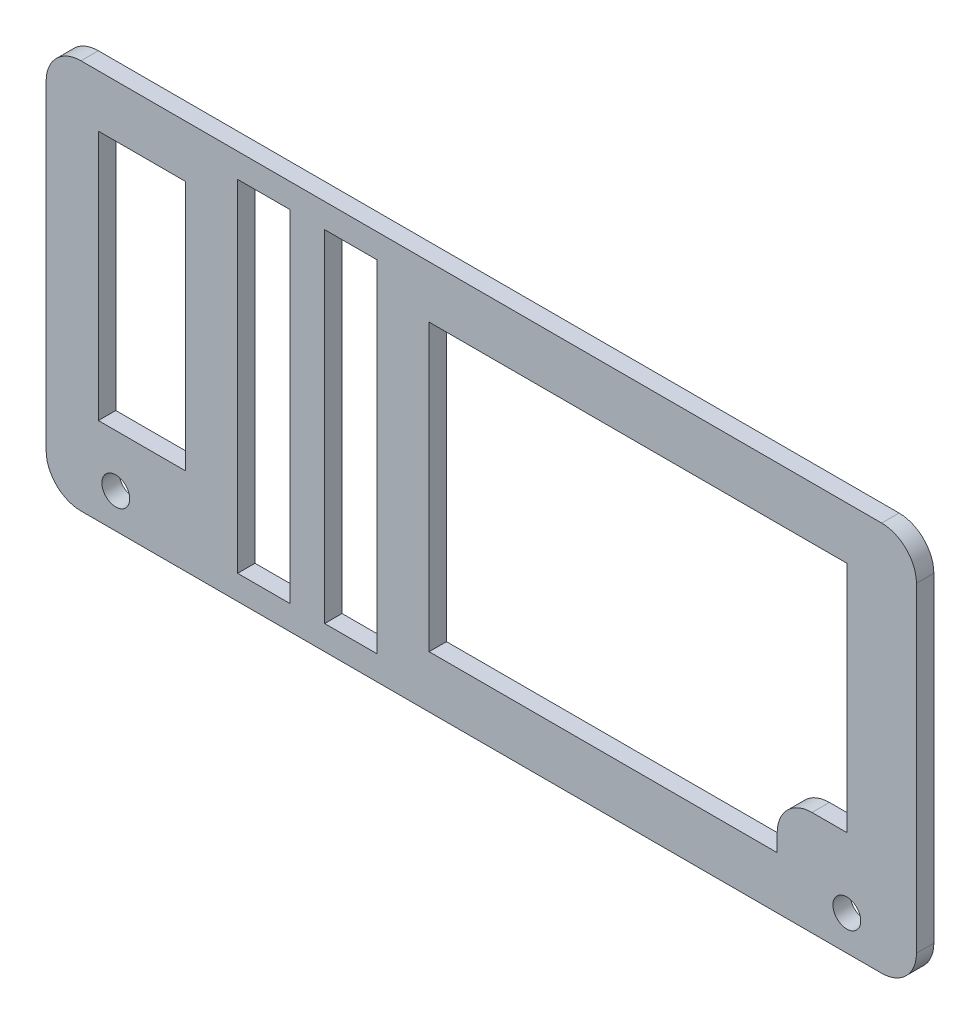
ISO-10303-21;
HEADER;
FILE_DESCRIPTION(('STEP AP214'),'2;1');
FILE_NAME('part.step','',(''),(''),'','','');
FILE_SCHEMA(('AUTOMOTIVE_DESIGN { 1 0 10303 214 1 1 1 1 }'));
ENDSEC;
DATA;
#1=APPLICATION_CONTEXT('core data for automotive mechanical design processes');
#2=APPLICATION_PROTOCOL_DEFINITION('international standard','automotive_design',2000,#1);
#3=PRODUCT_CONTEXT('',#1,'mechanical');
#4=PRODUCT('Part','Part','',(#3));
#5=PRODUCT_RELATED_PRODUCT_CATEGORY('part','',(#4));
#6=PRODUCT_DEFINITION_FORMATION('','',#4);
#7=PRODUCT_DEFINITION_CONTEXT('part definition',#1,'design');
#8=PRODUCT_DEFINITION('design','',#6,#7);
#9=PRODUCT_DEFINITION_SHAPE('','',#8);
#10=(LENGTH_UNIT() NAMED_UNIT(*) SI_UNIT(.MILLI.,.METRE.));
#11=(NAMED_UNIT(*) PLANE_ANGLE_UNIT() SI_UNIT($,.RADIAN.));
#12=(NAMED_UNIT(*) SI_UNIT($,.STERADIAN.) SOLID_ANGLE_UNIT());
#13=UNCERTAINTY_MEASURE_WITH_UNIT(LENGTH_MEASURE(1.E-05),#10,'distance_accuracy_value','');
#14=(GEOMETRIC_REPRESENTATION_CONTEXT(3) GLOBAL_UNCERTAINTY_ASSIGNED_CONTEXT((#13)) GLOBAL_UNIT_ASSIGNED_CONTEXT((#10,
#11,#12)) REPRESENTATION_CONTEXT('',''));
#15=CARTESIAN_POINT('',(0.,0.,0.));
#16=DIRECTION('',(0.,0.,1.));
#17=DIRECTION('',(1.,0.,0.));
#18=AXIS2_PLACEMENT_3D('',#15,#16,#17);
#19=CARTESIAN_POINT('',(-182.664233576642,87.9124087591241,5.));
#20=DIRECTION('',(1.,0.,0.));
#21=DIRECTION('',(0.,0.,-1.));
#22=AXIS2_PLACEMENT_3D('',#19,#20,#21);
#23=PLANE('',#22);
#24=DIRECTION('',(0.,-1.,0.));
#25=VECTOR('',#24,1.);
#26=CARTESIAN_POINT('',(-182.664233576642,87.9124087591241,0.));
#27=LINE('',#26,#25);
#28=CARTESIAN_POINT('',(-182.664233576642,77.9124087591241,0.));
#29=VERTEX_POINT('',#28);
#30=CARTESIAN_POINT('',(-182.664233576642,-14.0875912408759,0.));
#31=VERTEX_POINT('',#30);
#32=EDGE_CURVE('E339',#29,#31,#27,.T.);
#33=ORIENTED_EDGE('',*,*,#32,.T.);
#34=DIRECTION('',(0.,0.,-1.));
#35=VECTOR('',#34,1.);
#36=CARTESIAN_POINT('',(-182.664233576642,-14.0875912408759,5.));
#37=LINE('',#36,#35);
#38=CARTESIAN_POINT('',(-182.664233576642,-14.0875912408759,5.));
#39=VERTEX_POINT('',#38);
#40=EDGE_CURVE('E412',#31,#39,#37,.F.);
#41=ORIENTED_EDGE('',*,*,#40,.T.);
#42=DIRECTION('',(0.,-1.,0.));
#43=VECTOR('',#42,1.);
#44=CARTESIAN_POINT('',(-182.664233576642,87.9124087591241,5.));
#45=LINE('',#44,#43);
#46=CARTESIAN_POINT('',(-182.664233576642,77.9124087591241,5.));
#47=VERTEX_POINT('',#46);
#48=EDGE_CURVE('E325',#47,#39,#45,.T.);
#49=ORIENTED_EDGE('',*,*,#48,.F.);
#50=DIRECTION('',(0.,0.,-1.));
#51=VECTOR('',#50,1.);
#52=CARTESIAN_POINT('',(-182.664233576642,77.9124087591241,0.));
#53=LINE('',#52,#51);
#54=EDGE_CURVE('E409',#47,#29,#53,.T.);
#55=ORIENTED_EDGE('',*,*,#54,.T.);
#56=EDGE_LOOP('',(#33,#41,#49,#55));
#57=FACE_BOUND('',#56,.T.);
#58=ADVANCED_FACE('F34',(#57),#23,.F.);
#59=CARTESIAN_POINT('',(-182.664233576642,-24.0875912408759,5.));
#60=DIRECTION('',(0.,1.,0.));
#61=DIRECTION('',(0.,0.,1.));
#62=AXIS2_PLACEMENT_3D('',#59,#60,#61);
#63=PLANE('',#62);
#64=DIRECTION('',(1.,0.,0.));
#65=VECTOR('',#64,1.);
#66=CARTESIAN_POINT('',(-182.664233576642,-24.0875912408759,5.));
#67=LINE('',#66,#65);
#68=CARTESIAN_POINT('',(-172.664233576642,-24.0875912408759,5.));
#69=VERTEX_POINT('',#68);
#70=CARTESIAN_POINT('',(57.3357664233577,-24.0875912408759,5.));
#71=VERTEX_POINT('',#70);
#72=EDGE_CURVE('E328',#69,#71,#67,.T.);
#73=ORIENTED_EDGE('',*,*,#72,.F.);
#74=DIRECTION('',(0.,0.,-1.));
#75=VECTOR('',#74,1.);
#76=CARTESIAN_POINT('',(-172.664233576642,-24.0875912408759,5.));
#77=LINE('',#76,#75);
#78=CARTESIAN_POINT('',(-172.664233576642,-24.0875912408759,0.));
#79=VERTEX_POINT('',#78);
#80=EDGE_CURVE('E396',#69,#79,#77,.T.);
#81=ORIENTED_EDGE('',*,*,#80,.T.);
#82=DIRECTION('',(1.,0.,0.));
#83=VECTOR('',#82,1.);
#84=CARTESIAN_POINT('',(-182.664233576642,-24.0875912408759,0.));
#85=LINE('',#84,#83);
#86=CARTESIAN_POINT('',(57.3357664233577,-24.0875912408759,0.));
#87=VERTEX_POINT('',#86);
#88=EDGE_CURVE('E342',#79,#87,#85,.T.);
#89=ORIENTED_EDGE('',*,*,#88,.T.);
#90=DIRECTION('',(0.,0.,-1.));
#91=VECTOR('',#90,1.);
#92=CARTESIAN_POINT('',(57.3357664233577,-24.0875912408759,5.));
#93=LINE('',#92,#91);
#94=EDGE_CURVE('E394',#87,#71,#93,.F.);
#95=ORIENTED_EDGE('',*,*,#94,.T.);
#96=EDGE_LOOP('',(#73,#81,#89,#95));
#97=FACE_BOUND('',#96,.T.);
#98=ADVANCED_FACE('F458',(#97),#63,.F.);
#99=CARTESIAN_POINT('',(67.3357664233577,87.9124087591241,5.));
#100=DIRECTION('',(1.,0.,0.));
#101=DIRECTION('',(0.,0.,-1.));
#102=AXIS2_PLACEMENT_3D('',#99,#100,#101);
#103=PLANE('',#102);
#104=DIRECTION('',(0.,-1.,0.));
#105=VECTOR('',#104,1.);
#106=CARTESIAN_POINT('',(67.3357664233577,87.9124087591241,5.));
#107=LINE('',#106,#105);
#108=CARTESIAN_POINT('',(67.3357664233577,77.9124087591241,5.));
#109=VERTEX_POINT('',#108);
#110=CARTESIAN_POINT('',(67.3357664233577,-14.0875912408759,5.));
#111=VERTEX_POINT('',#110);
#112=EDGE_CURVE('E332',#109,#111,#107,.T.);
#113=ORIENTED_EDGE('',*,*,#112,.T.);
#114=DIRECTION('',(0.,0.,-1.));
#115=VECTOR('',#114,1.);
#116=CARTESIAN_POINT('',(67.3357664233577,-14.0875912408759,0.));
#117=LINE('',#116,#115);
#118=CARTESIAN_POINT('',(67.3357664233577,-14.0875912408759,0.));
#119=VERTEX_POINT('',#118);
#120=EDGE_CURVE('E431',#111,#119,#117,.T.);
#121=ORIENTED_EDGE('',*,*,#120,.T.);
#122=DIRECTION('',(0.,-1.,0.));
#123=VECTOR('',#122,1.);
#124=CARTESIAN_POINT('',(67.3357664233577,87.9124087591241,0.));
#125=LINE('',#124,#123);
#126=CARTESIAN_POINT('',(67.3357664233577,77.9124087591241,0.));
#127=VERTEX_POINT('',#126);
#128=EDGE_CURVE('E345',#127,#119,#125,.T.);
#129=ORIENTED_EDGE('',*,*,#128,.F.);
#130=DIRECTION('',(0.,0.,-1.));
#131=VECTOR('',#130,1.);
#132=CARTESIAN_POINT('',(67.3357664233577,77.9124087591241,5.));
#133=LINE('',#132,#131);
#134=EDGE_CURVE('E429',#127,#109,#133,.F.);
#135=ORIENTED_EDGE('',*,*,#134,.T.);
#136=EDGE_LOOP('',(#113,#121,#129,#135));
#137=FACE_BOUND('',#136,.T.);
#138=ADVANCED_FACE('F466',(#137),#103,.T.);
#139=CARTESIAN_POINT('',(-182.664233576642,87.9124087591241,5.));
#140=DIRECTION('',(0.,1.,0.));
#141=DIRECTION('',(0.,0.,1.));
#142=AXIS2_PLACEMENT_3D('',#139,#140,#141);
#143=PLANE('',#142);
#144=DIRECTION('',(1.,0.,0.));
#145=VECTOR('',#144,1.);
#146=CARTESIAN_POINT('',(-182.664233576642,87.9124087591241,5.));
#147=LINE('',#146,#145);
#148=CARTESIAN_POINT('',(-172.664233576642,87.9124087591241,5.));
#149=VERTEX_POINT('',#148);
#150=CARTESIAN_POINT('',(57.3357664233577,87.9124087591241,5.));
#151=VERTEX_POINT('',#150);
#152=EDGE_CURVE('E335',#149,#151,#147,.T.);
#153=ORIENTED_EDGE('',*,*,#152,.T.);
#154=DIRECTION('',(0.,0.,-1.));
#155=VECTOR('',#154,1.);
#156=CARTESIAN_POINT('',(57.3357664233577,87.9124087591241,5.));
#157=LINE('',#156,#155);
#158=CARTESIAN_POINT('',(57.3357664233577,87.9124087591241,0.));
#159=VERTEX_POINT('',#158);
#160=EDGE_CURVE('E11',#151,#159,#157,.T.);
#161=ORIENTED_EDGE('',*,*,#160,.T.);
#162=DIRECTION('',(1.,0.,0.));
#163=VECTOR('',#162,1.);
#164=CARTESIAN_POINT('',(-182.664233576642,87.9124087591241,0.));
#165=LINE('',#164,#163);
#166=CARTESIAN_POINT('',(-172.664233576642,87.9124087591241,0.));
#167=VERTEX_POINT('',#166);
#168=EDGE_CURVE('E329',#167,#159,#165,.T.);
#169=ORIENTED_EDGE('',*,*,#168,.F.);
#170=DIRECTION('',(0.,0.,-1.));
#171=VECTOR('',#170,1.);
#172=CARTESIAN_POINT('',(-172.664233576642,87.9124087591241,5.));
#173=LINE('',#172,#171);
#174=EDGE_CURVE('E42',#167,#149,#173,.F.);
#175=ORIENTED_EDGE('',*,*,#174,.T.);
#176=EDGE_LOOP('',(#153,#161,#169,#175));
#177=FACE_BOUND('',#176,.T.);
#178=ADVANCED_FACE('F437',(#177),#143,.T.);
#179=CARTESIAN_POINT('',(0.,0.,5.));
#180=DIRECTION('',(0.,0.,1.));
#181=DIRECTION('',(1.,0.,0.));
#182=AXIS2_PLACEMENT_3D('',#179,#180,#181);
#183=PLANE('',#182);
#184=DIRECTION('',(-1.,0.,0.));
#185=VECTOR('',#184,1.);
#186=CARTESIAN_POINT('',(-167.664233576642,72.9124087591241,5.));
#187=LINE('',#186,#185);
#188=CARTESIAN_POINT('',(-142.664233576642,72.9124087591241,5.));
#189=VERTEX_POINT('',#188);
#190=CARTESIAN_POINT('',(-167.664233576642,72.9124087591241,5.));
#191=VERTEX_POINT('',#190);
#192=EDGE_CURVE('E49',#189,#191,#187,.T.);
#193=ORIENTED_EDGE('',*,*,#192,.F.);
#194=DIRECTION('',(0.,1.,0.));
#195=VECTOR('',#194,1.);
#196=CARTESIAN_POINT('',(-142.664233576642,72.9124087591241,5.));
#197=LINE('',#196,#195);
#198=CARTESIAN_POINT('',(-142.664233576642,0.912408759124103,5.));
#199=VERTEX_POINT('',#198);
#200=EDGE_CURVE('E231',#199,#189,#197,.T.);
#201=ORIENTED_EDGE('',*,*,#200,.F.);
#202=DIRECTION('',(1.,0.,0.));
#203=VECTOR('',#202,1.);
#204=CARTESIAN_POINT('',(-142.664233576642,0.912408759124103,5.));
#205=LINE('',#204,#203);
#206=CARTESIAN_POINT('',(-167.664233576642,0.912408759124099,5.));
#207=VERTEX_POINT('',#206);
#208=EDGE_CURVE('E234',#207,#199,#205,.T.);
#209=ORIENTED_EDGE('',*,*,#208,.F.);
#210=DIRECTION('',(0.,-1.,0.));
#211=VECTOR('',#210,1.);
#212=CARTESIAN_POINT('',(-167.664233576642,0.912408759124099,5.));
#213=LINE('',#212,#211);
#214=EDGE_CURVE('E240',#191,#207,#213,.T.);
#215=ORIENTED_EDGE('',*,*,#214,.F.);
#216=EDGE_LOOP('',(#193,#201,#209,#215));
#217=FACE_BOUND('',#216,.T.);
#218=DIRECTION('',(1.,0.,0.));
#219=VECTOR('',#218,1.);
#220=CARTESIAN_POINT('',(47.3357664233577,5.9124087591241,5.));
#221=LINE('',#220,#219);
#222=CARTESIAN_POINT('',(37.3357664233577,5.9124087591241,5.));
#223=VERTEX_POINT('',#222);
#224=CARTESIAN_POINT('',(47.3357664233577,5.9124087591241,5.));
#225=VERTEX_POINT('',#224);
#226=EDGE_CURVE('E261',#223,#225,#221,.T.);
#227=ORIENTED_EDGE('',*,*,#226,.F.);
#228=CARTESIAN_POINT('',(37.3357664233577,-4.0875912408759,5.));
#229=DIRECTION('',(0.,0.,1.));
#230=DIRECTION('',(1.,0.,0.));
#231=AXIS2_PLACEMENT_3D('',#228,#229,#230);
#232=CIRCLE('',#231,10.);
#233=CARTESIAN_POINT('',(27.3357664233577,-4.0875912408759,5.));
#234=VERTEX_POINT('',#233);
#235=EDGE_CURVE('E420',#223,#234,#232,.T.);
#236=ORIENTED_EDGE('',*,*,#235,.T.);
#237=DIRECTION('',(0.,1.,0.));
#238=VECTOR('',#237,1.);
#239=CARTESIAN_POINT('',(27.3357664233577,5.9124087591241,5.));
#240=LINE('',#239,#238);
#241=CARTESIAN_POINT('',(27.3357664233577,-9.08759124087591,5.));
#242=VERTEX_POINT('',#241);
#243=EDGE_CURVE('E258',#242,#234,#240,.T.);
#244=ORIENTED_EDGE('',*,*,#243,.F.);
#245=DIRECTION('',(1.,0.,0.));
#246=VECTOR('',#245,1.);
#247=CARTESIAN_POINT('',(27.3357664233577,-9.08759124087591,5.));
#248=LINE('',#247,#246);
#249=CARTESIAN_POINT('',(-72.6642335766423,-9.08759124087592,5.));
#250=VERTEX_POINT('',#249);
#251=EDGE_CURVE('E255',#250,#242,#248,.T.);
#252=ORIENTED_EDGE('',*,*,#251,.F.);
#253=DIRECTION('',(0.,-1.,0.));
#254=VECTOR('',#253,1.);
#255=CARTESIAN_POINT('',(-72.6642335766423,72.9124087591241,5.));
#256=LINE('',#255,#254);
#257=CARTESIAN_POINT('',(-72.6642335766423,72.9124087591241,5.));
#258=VERTEX_POINT('',#257);
#259=EDGE_CURVE('E252',#258,#250,#256,.T.);
#260=ORIENTED_EDGE('',*,*,#259,.F.);
#261=DIRECTION('',(-1.,0.,0.));
#262=VECTOR('',#261,1.);
#263=CARTESIAN_POINT('',(17.3977296832203,72.9124087591241,5.));
#264=LINE('',#263,#262);
#265=CARTESIAN_POINT('',(47.3357664233577,72.9124087591241,5.));
#266=VERTEX_POINT('',#265);
#267=EDGE_CURVE('E246',#266,#258,#264,.T.);
#268=ORIENTED_EDGE('',*,*,#267,.F.);
#269=DIRECTION('',(0.,1.,0.));
#270=VECTOR('',#269,1.);
#271=CARTESIAN_POINT('',(47.3357664233577,72.9124087591241,5.));
#272=LINE('',#271,#270);
#273=EDGE_CURVE('E263',#225,#266,#272,.T.);
#274=ORIENTED_EDGE('',*,*,#273,.F.);
#275=EDGE_LOOP('',(#227,#236,#244,#252,#260,#268,#274));
#276=FACE_BOUND('',#275,.T.);
#277=DIRECTION('',(0.,1.,0.));
#278=VECTOR('',#277,1.);
#279=CARTESIAN_POINT('',(-112.664233576642,80.9124087591241,5.));
#280=LINE('',#279,#278);
#281=CARTESIAN_POINT('',(-112.664233576642,-17.0875912408759,5.));
#282=VERTEX_POINT('',#281);
#283=CARTESIAN_POINT('',(-112.664233576642,80.9124087591241,5.));
#284=VERTEX_POINT('',#283);
#285=EDGE_CURVE('E269',#282,#284,#280,.T.);
#286=ORIENTED_EDGE('',*,*,#285,.F.);
#287=DIRECTION('',(1.,0.,0.));
#288=VECTOR('',#287,1.);
#289=CARTESIAN_POINT('',(-127.664233576642,-17.0875912408759,5.));
#290=LINE('',#289,#288);
#291=CARTESIAN_POINT('',(-127.664233576642,-17.0875912408759,5.));
#292=VERTEX_POINT('',#291);
#293=EDGE_CURVE('E285',#292,#282,#290,.T.);
#294=ORIENTED_EDGE('',*,*,#293,.F.);
#295=DIRECTION('',(0.,-1.,0.));
#296=VECTOR('',#295,1.);
#297=CARTESIAN_POINT('',(-127.664233576642,80.9124087591241,5.));
#298=LINE('',#297,#296);
#299=CARTESIAN_POINT('',(-127.664233576642,80.9124087591241,5.));
#300=VERTEX_POINT('',#299);
#301=EDGE_CURVE('E282',#300,#292,#298,.T.);
#302=ORIENTED_EDGE('',*,*,#301,.F.);
#303=DIRECTION('',(-1.,0.,0.));
#304=VECTOR('',#303,1.);
#305=CARTESIAN_POINT('',(-112.664233576642,80.9124087591241,5.));
#306=LINE('',#305,#304);
#307=EDGE_CURVE('E279',#284,#300,#306,.T.);
#308=ORIENTED_EDGE('',*,*,#307,.F.);
#309=EDGE_LOOP('',(#286,#294,#302,#308));
#310=FACE_BOUND('',#309,.T.);
#311=DIRECTION('',(-1.,0.,0.));
#312=VECTOR('',#311,1.);
#313=CARTESIAN_POINT('',(-102.664233576642,80.9124087591241,5.));
#314=LINE('',#313,#312);
#315=CARTESIAN_POINT('',(-87.6642335766423,80.9124087591241,5.));
#316=VERTEX_POINT('',#315);
#317=CARTESIAN_POINT('',(-102.664233576642,80.9124087591241,5.));
#318=VERTEX_POINT('',#317);
#319=EDGE_CURVE('E291',#316,#318,#314,.T.);
#320=ORIENTED_EDGE('',*,*,#319,.F.);
#321=DIRECTION('',(0.,1.,0.));
#322=VECTOR('',#321,1.);
#323=CARTESIAN_POINT('',(-87.6642335766423,-17.0875912408759,5.));
#324=LINE('',#323,#322);
#325=CARTESIAN_POINT('',(-87.6642335766423,-17.0875912408759,5.));
#326=VERTEX_POINT('',#325);
#327=EDGE_CURVE('E305',#326,#316,#324,.T.);
#328=ORIENTED_EDGE('',*,*,#327,.F.);
#329=DIRECTION('',(1.,0.,0.));
#330=VECTOR('',#329,1.);
#331=CARTESIAN_POINT('',(-87.6642335766423,-17.0875912408759,5.));
#332=LINE('',#331,#330);
#333=CARTESIAN_POINT('',(-102.664233576642,-17.0875912408759,5.));
#334=VERTEX_POINT('',#333);
#335=EDGE_CURVE('E302',#334,#326,#332,.T.);
#336=ORIENTED_EDGE('',*,*,#335,.F.);
#337=DIRECTION('',(0.,-1.,0.));
#338=VECTOR('',#337,1.);
#339=CARTESIAN_POINT('',(-102.664233576642,-17.0875912408759,5.));
#340=LINE('',#339,#338);
#341=EDGE_CURVE('E299',#318,#334,#340,.T.);
#342=ORIENTED_EDGE('',*,*,#341,.F.);
#343=EDGE_LOOP('',(#320,#328,#336,#342));
#344=FACE_BOUND('',#343,.T.);
#345=CARTESIAN_POINT('',(47.3357664233577,-14.0875912408759,5.));
#346=DIRECTION('',(0.,0.,1.));
#347=DIRECTION('',(1.,0.,0.));
#348=AXIS2_PLACEMENT_3D('',#345,#346,#347);
#349=CIRCLE('',#348,4.00000000000001);
#350=CARTESIAN_POINT('',(51.3357664233577,-14.0875912408759,5.));
#351=VERTEX_POINT('',#350);
#352=EDGE_CURVE('E311',#351,#351,#349,.T.);
#353=ORIENTED_EDGE('',*,*,#352,.F.);
#354=EDGE_LOOP('',(#353));
#355=FACE_BOUND('',#354,.T.);
#356=CARTESIAN_POINT('',(-162.664233576642,-14.0875912408759,5.));
#357=DIRECTION('',(0.,0.,1.));
#358=DIRECTION('',(1.,0.,0.));
#359=AXIS2_PLACEMENT_3D('',#356,#357,#358);
#360=CIRCLE('',#359,3.99999999999999);
#361=CARTESIAN_POINT('',(-158.664233576642,-14.0875912408759,5.));
#362=VERTEX_POINT('',#361);
#363=EDGE_CURVE('E321',#362,#362,#360,.T.);
#364=ORIENTED_EDGE('',*,*,#363,.F.);
#365=EDGE_LOOP('',(#364));
#366=FACE_BOUND('',#365,.T.);
#367=ORIENTED_EDGE('',*,*,#48,.T.);
#368=CARTESIAN_POINT('',(-172.664233576642,-14.0875912408759,5.));
#369=DIRECTION('',(0.,0.,1.));
#370=DIRECTION('',(1.,0.,0.));
#371=AXIS2_PLACEMENT_3D('',#368,#369,#370);
#372=CIRCLE('',#371,10.);
#373=EDGE_CURVE('E422',#39,#69,#372,.T.);
#374=ORIENTED_EDGE('',*,*,#373,.T.);
#375=ORIENTED_EDGE('',*,*,#72,.T.);
#376=CARTESIAN_POINT('',(57.3357664233577,-14.0875912408759,5.));
#377=DIRECTION('',(0.,0.,1.));
#378=DIRECTION('',(1.,0.,0.));
#379=AXIS2_PLACEMENT_3D('',#376,#377,#378);
#380=CIRCLE('',#379,10.);
#381=EDGE_CURVE('E418',#71,#111,#380,.T.);
#382=ORIENTED_EDGE('',*,*,#381,.T.);
#383=ORIENTED_EDGE('',*,*,#112,.F.);
#384=CARTESIAN_POINT('',(57.3357664233577,77.9124087591241,5.));
#385=DIRECTION('',(0.,0.,1.));
#386=DIRECTION('',(1.,0.,0.));
#387=AXIS2_PLACEMENT_3D('',#384,#385,#386);
#388=CIRCLE('',#387,10.);
#389=EDGE_CURVE('E416',#109,#151,#388,.T.);
#390=ORIENTED_EDGE('',*,*,#389,.T.);
#391=ORIENTED_EDGE('',*,*,#152,.F.);
#392=CARTESIAN_POINT('',(-172.664233576642,77.9124087591241,5.));
#393=DIRECTION('',(0.,0.,1.));
#394=DIRECTION('',(1.,0.,0.));
#395=AXIS2_PLACEMENT_3D('',#392,#393,#394);
#396=CIRCLE('',#395,10.);
#397=EDGE_CURVE('E414',#149,#47,#396,.T.);
#398=ORIENTED_EDGE('',*,*,#397,.T.);
#399=EDGE_LOOP('',(#367,#374,#375,#382,#383,#390,#391,#398));
#400=FACE_BOUND('',#399,.T.);
#401=ADVANCED_FACE('F442',(#217,#276,#310,#344,#355,#366,#400),#183,.T.);
#402=CARTESIAN_POINT('',(0.,0.,0.));
#403=DIRECTION('',(0.,0.,1.));
#404=DIRECTION('',(1.,0.,0.));
#405=AXIS2_PLACEMENT_3D('',#402,#403,#404);
#406=PLANE('',#405);
#407=DIRECTION('',(0.,1.,0.));
#408=VECTOR('',#407,1.);
#409=CARTESIAN_POINT('',(-142.664233576642,72.9124087591241,0.));
#410=LINE('',#409,#408);
#411=CARTESIAN_POINT('',(-142.664233576642,0.912408759124103,0.));
#412=VERTEX_POINT('',#411);
#413=CARTESIAN_POINT('',(-142.664233576642,72.9124087591241,0.));
#414=VERTEX_POINT('',#413);
#415=EDGE_CURVE('E221',#412,#414,#410,.T.);
#416=ORIENTED_EDGE('',*,*,#415,.T.);
#417=DIRECTION('',(-1.,0.,0.));
#418=VECTOR('',#417,1.);
#419=CARTESIAN_POINT('',(-167.664233576642,72.9124087591241,0.));
#420=LINE('',#419,#418);
#421=CARTESIAN_POINT('',(-167.664233576642,72.9124087591241,0.));
#422=VERTEX_POINT('',#421);
#423=EDGE_CURVE('E215',#414,#422,#420,.T.);
#424=ORIENTED_EDGE('',*,*,#423,.T.);
#425=DIRECTION('',(0.,-1.,0.));
#426=VECTOR('',#425,1.);
#427=CARTESIAN_POINT('',(-167.664233576642,0.912408759124099,0.));
#428=LINE('',#427,#426);
#429=CARTESIAN_POINT('',(-167.664233576642,0.912408759124099,0.));
#430=VERTEX_POINT('',#429);
#431=EDGE_CURVE('E224',#422,#430,#428,.T.);
#432=ORIENTED_EDGE('',*,*,#431,.T.);
#433=DIRECTION('',(1.,0.,0.));
#434=VECTOR('',#433,1.);
#435=CARTESIAN_POINT('',(-142.664233576642,0.912408759124103,0.));
#436=LINE('',#435,#434);
#437=EDGE_CURVE('E57',#430,#412,#436,.T.);
#438=ORIENTED_EDGE('',*,*,#437,.T.);
#439=EDGE_LOOP('',(#416,#424,#432,#438));
#440=FACE_BOUND('',#439,.T.);
#441=DIRECTION('',(0.,1.,0.));
#442=VECTOR('',#441,1.);
#443=CARTESIAN_POINT('',(27.3357664233577,0.,0.));
#444=LINE('',#443,#442);
#445=CARTESIAN_POINT('',(27.3357664233577,-9.08759124087591,0.));
#446=VERTEX_POINT('',#445);
#447=CARTESIAN_POINT('',(27.3357664233577,-4.0875912408759,0.));
#448=VERTEX_POINT('',#447);
#449=EDGE_CURVE('E386',#446,#448,#444,.T.);
#450=ORIENTED_EDGE('',*,*,#449,.T.);
#451=CARTESIAN_POINT('',(37.3357664233577,-4.0875912408759,0.));
#452=DIRECTION('',(0.,0.,1.));
#453=DIRECTION('',(1.,0.,0.));
#454=AXIS2_PLACEMENT_3D('',#451,#452,#453);
#455=CIRCLE('',#454,10.);
#456=CARTESIAN_POINT('',(37.3357664233577,5.9124087591241,0.));
#457=VERTEX_POINT('',#456);
#458=EDGE_CURVE('E405',#448,#457,#455,.F.);
#459=ORIENTED_EDGE('',*,*,#458,.T.);
#460=DIRECTION('',(1.,0.,0.));
#461=VECTOR('',#460,1.);
#462=CARTESIAN_POINT('',(0.,5.9124087591241,0.));
#463=LINE('',#462,#461);
#464=CARTESIAN_POINT('',(47.3357664233577,5.9124087591241,0.));
#465=VERTEX_POINT('',#464);
#466=EDGE_CURVE('E389',#457,#465,#463,.T.);
#467=ORIENTED_EDGE('',*,*,#466,.T.);
#468=DIRECTION('',(0.,1.,0.));
#469=VECTOR('',#468,1.);
#470=CARTESIAN_POINT('',(47.3357664233577,0.,0.));
#471=LINE('',#470,#469);
#472=CARTESIAN_POINT('',(47.3357664233577,72.9124087591241,0.));
#473=VERTEX_POINT('',#472);
#474=EDGE_CURVE('E391',#465,#473,#471,.T.);
#475=ORIENTED_EDGE('',*,*,#474,.T.);
#476=DIRECTION('',(-1.,0.,0.));
#477=VECTOR('',#476,1.);
#478=CARTESIAN_POINT('',(0.,72.9124087591241,0.));
#479=LINE('',#478,#477);
#480=CARTESIAN_POINT('',(-72.6642335766423,72.9124087591241,0.));
#481=VERTEX_POINT('',#480);
#482=EDGE_CURVE('E377',#473,#481,#479,.T.);
#483=ORIENTED_EDGE('',*,*,#482,.T.);
#484=DIRECTION('',(0.,-1.,0.));
#485=VECTOR('',#484,1.);
#486=CARTESIAN_POINT('',(-72.6642335766423,0.,0.));
#487=LINE('',#486,#485);
#488=CARTESIAN_POINT('',(-72.6642335766423,-9.08759124087592,0.));
#489=VERTEX_POINT('',#488);
#490=EDGE_CURVE('E380',#481,#489,#487,.T.);
#491=ORIENTED_EDGE('',*,*,#490,.T.);
#492=DIRECTION('',(1.,0.,0.));
#493=VECTOR('',#492,1.);
#494=CARTESIAN_POINT('',(0.,-9.08759124087591,0.));
#495=LINE('',#494,#493);
#496=EDGE_CURVE('E383',#489,#446,#495,.T.);
#497=ORIENTED_EDGE('',*,*,#496,.T.);
#498=EDGE_LOOP('',(#450,#459,#467,#475,#483,#491,#497));
#499=FACE_BOUND('',#498,.T.);
#500=DIRECTION('',(1.,0.,0.));
#501=VECTOR('',#500,1.);
#502=CARTESIAN_POINT('',(0.,-17.087591240876,0.));
#503=LINE('',#502,#501);
#504=CARTESIAN_POINT('',(-127.664233576642,-17.0875912408759,0.));
#505=VERTEX_POINT('',#504);
#506=CARTESIAN_POINT('',(-112.664233576642,-17.0875912408759,0.));
#507=VERTEX_POINT('',#506);
#508=EDGE_CURVE('E371',#505,#507,#503,.T.);
#509=ORIENTED_EDGE('',*,*,#508,.T.);
#510=DIRECTION('',(0.,1.,0.));
#511=VECTOR('',#510,1.);
#512=CARTESIAN_POINT('',(-112.664233576642,0.,0.));
#513=LINE('',#512,#511);
#514=CARTESIAN_POINT('',(-112.664233576642,80.9124087591241,0.));
#515=VERTEX_POINT('',#514);
#516=EDGE_CURVE('E374',#507,#515,#513,.T.);
#517=ORIENTED_EDGE('',*,*,#516,.T.);
#518=DIRECTION('',(-1.,0.,0.));
#519=VECTOR('',#518,1.);
#520=CARTESIAN_POINT('',(0.,80.9124087591241,0.));
#521=LINE('',#520,#519);
#522=CARTESIAN_POINT('',(-127.664233576642,80.9124087591241,0.));
#523=VERTEX_POINT('',#522);
#524=EDGE_CURVE('E365',#515,#523,#521,.T.);
#525=ORIENTED_EDGE('',*,*,#524,.T.);
#526=DIRECTION('',(0.,-1.,0.));
#527=VECTOR('',#526,1.);
#528=CARTESIAN_POINT('',(-127.664233576642,0.,0.));
#529=LINE('',#528,#527);
#530=EDGE_CURVE('E368',#523,#505,#529,.T.);
#531=ORIENTED_EDGE('',*,*,#530,.T.);
#532=EDGE_LOOP('',(#509,#517,#525,#531));
#533=FACE_BOUND('',#532,.T.);
#534=DIRECTION('',(0.,1.,0.));
#535=VECTOR('',#534,1.);
#536=CARTESIAN_POINT('',(-87.6642335766423,0.,0.));
#537=LINE('',#536,#535);
#538=CARTESIAN_POINT('',(-87.6642335766423,-17.0875912408759,0.));
#539=VERTEX_POINT('',#538);
#540=CARTESIAN_POINT('',(-87.6642335766423,80.9124087591241,0.));
#541=VERTEX_POINT('',#540);
#542=EDGE_CURVE('E359',#539,#541,#537,.T.);
#543=ORIENTED_EDGE('',*,*,#542,.T.);
#544=DIRECTION('',(-1.,0.,0.));
#545=VECTOR('',#544,1.);
#546=CARTESIAN_POINT('',(0.,80.9124087591241,0.));
#547=LINE('',#546,#545);
#548=CARTESIAN_POINT('',(-102.664233576642,80.9124087591241,0.));
#549=VERTEX_POINT('',#548);
#550=EDGE_CURVE('E362',#541,#549,#547,.T.);
#551=ORIENTED_EDGE('',*,*,#550,.T.);
#552=DIRECTION('',(0.,-1.,0.));
#553=VECTOR('',#552,1.);
#554=CARTESIAN_POINT('',(-102.664233576642,0.,0.));
#555=LINE('',#554,#553);
#556=CARTESIAN_POINT('',(-102.664233576642,-17.0875912408759,0.));
#557=VERTEX_POINT('',#556);
#558=EDGE_CURVE('E338',#549,#557,#555,.T.);
#559=ORIENTED_EDGE('',*,*,#558,.T.);
#560=DIRECTION('',(1.,0.,0.));
#561=VECTOR('',#560,1.);
#562=CARTESIAN_POINT('',(0.,-17.0875912408758,0.));
#563=LINE('',#562,#561);
#564=EDGE_CURVE('E356',#557,#539,#563,.T.);
#565=ORIENTED_EDGE('',*,*,#564,.T.);
#566=EDGE_LOOP('',(#543,#551,#559,#565));
#567=FACE_BOUND('',#566,.T.);
#568=CARTESIAN_POINT('',(47.3357664233577,-14.0875912408759,0.));
#569=DIRECTION('',(0.,0.,1.));
#570=DIRECTION('',(1.,0.,0.));
#571=AXIS2_PLACEMENT_3D('',#568,#569,#570);
#572=CIRCLE('',#571,4.00000000000001);
#573=CARTESIAN_POINT('',(51.3357664233577,-14.0875912408759,0.));
#574=VERTEX_POINT('',#573);
#575=EDGE_CURVE('E320',#574,#574,#572,.T.);
#576=ORIENTED_EDGE('',*,*,#575,.T.);
#577=EDGE_LOOP('',(#576));
#578=FACE_BOUND('',#577,.T.);
#579=CARTESIAN_POINT('',(-162.664233576642,-14.0875912408759,0.));
#580=DIRECTION('',(0.,0.,1.));
#581=DIRECTION('',(1.,0.,0.));
#582=AXIS2_PLACEMENT_3D('',#579,#580,#581);
#583=CIRCLE('',#582,3.99999999999999);
#584=CARTESIAN_POINT('',(-158.664233576642,-14.0875912408759,0.));
#585=VERTEX_POINT('',#584);
#586=EDGE_CURVE('E324',#585,#585,#583,.T.);
#587=ORIENTED_EDGE('',*,*,#586,.T.);
#588=EDGE_LOOP('',(#587));
#589=FACE_BOUND('',#588,.T.);
#590=ORIENTED_EDGE('',*,*,#88,.F.);
#591=CARTESIAN_POINT('',(-172.664233576642,-14.0875912408759,0.));
#592=DIRECTION('',(0.,0.,1.));
#593=DIRECTION('',(1.,0.,0.));
#594=AXIS2_PLACEMENT_3D('',#591,#592,#593);
#595=CIRCLE('',#594,10.);
#596=EDGE_CURVE('E407',#79,#31,#595,.F.);
#597=ORIENTED_EDGE('',*,*,#596,.T.);
#598=ORIENTED_EDGE('',*,*,#32,.F.);
#599=CARTESIAN_POINT('',(-172.664233576642,77.9124087591241,0.));
#600=DIRECTION('',(0.,0.,1.));
#601=DIRECTION('',(1.,0.,0.));
#602=AXIS2_PLACEMENT_3D('',#599,#600,#601);
#603=CIRCLE('',#602,10.);
#604=EDGE_CURVE('E399',#29,#167,#603,.F.);
#605=ORIENTED_EDGE('',*,*,#604,.T.);
#606=ORIENTED_EDGE('',*,*,#168,.T.);
#607=CARTESIAN_POINT('',(57.3357664233577,77.9124087591241,0.));
#608=DIRECTION('',(0.,0.,1.));
#609=DIRECTION('',(1.,0.,0.));
#610=AXIS2_PLACEMENT_3D('',#607,#608,#609);
#611=CIRCLE('',#610,10.);
#612=EDGE_CURVE('E401',#159,#127,#611,.F.);
#613=ORIENTED_EDGE('',*,*,#612,.T.);
#614=ORIENTED_EDGE('',*,*,#128,.T.);
#615=CARTESIAN_POINT('',(57.3357664233577,-14.0875912408759,0.));
#616=DIRECTION('',(0.,0.,1.));
#617=DIRECTION('',(1.,0.,0.));
#618=AXIS2_PLACEMENT_3D('',#615,#616,#617);
#619=CIRCLE('',#618,10.);
#620=EDGE_CURVE('E403',#119,#87,#619,.F.);
#621=ORIENTED_EDGE('',*,*,#620,.T.);
#622=EDGE_LOOP('',(#590,#597,#598,#605,#606,#613,#614,#621));
#623=FACE_BOUND('',#622,.T.);
#624=ADVANCED_FACE('F228',(#440,#499,#533,#567,#578,#589,#623),#406,.F.);
#625=CARTESIAN_POINT('',(-162.664233576642,-14.0875912408759,-6.));
#626=DIRECTION('',(0.,0.,1.));
#627=DIRECTION('',(1.,0.,0.));
#628=AXIS2_PLACEMENT_3D('',#625,#626,#627);
#629=CYLINDRICAL_SURFACE('',#628,3.99999999999999);
#630=ORIENTED_EDGE('',*,*,#363,.T.);
#631=EDGE_LOOP('',(#630));
#632=FACE_BOUND('',#631,.T.);
#633=ORIENTED_EDGE('',*,*,#586,.F.);
#634=EDGE_LOOP('',(#633));
#635=FACE_BOUND('',#634,.T.);
#636=ADVANCED_FACE('F571',(#632,#635),#629,.F.);
#637=CARTESIAN_POINT('',(47.3357664233577,-14.0875912408759,-10.));
#638=DIRECTION('',(0.,0.,1.));
#639=DIRECTION('',(1.,0.,0.));
#640=AXIS2_PLACEMENT_3D('',#637,#638,#639);
#641=CYLINDRICAL_SURFACE('',#640,4.00000000000001);
#642=ORIENTED_EDGE('',*,*,#352,.T.);
#643=EDGE_LOOP('',(#642));
#644=FACE_BOUND('',#643,.T.);
#645=ORIENTED_EDGE('',*,*,#575,.F.);
#646=EDGE_LOOP('',(#645));
#647=FACE_BOUND('',#646,.T.);
#648=ADVANCED_FACE('F567',(#644,#647),#641,.F.);
#649=CARTESIAN_POINT('',(-102.664233576642,80.9124087591241,-10.));
#650=DIRECTION('',(0.,1.,0.));
#651=DIRECTION('',(0.,0.,1.));
#652=AXIS2_PLACEMENT_3D('',#649,#650,#651);
#653=PLANE('',#652);
#654=DIRECTION('',(0.,0.,1.));
#655=VECTOR('',#654,1.);
#656=CARTESIAN_POINT('',(-87.6642335766423,80.9124087591241,-10.));
#657=LINE('',#656,#655);
#658=EDGE_CURVE('E309',#541,#316,#657,.T.);
#659=ORIENTED_EDGE('',*,*,#658,.T.);
#660=ORIENTED_EDGE('',*,*,#319,.T.);
#661=DIRECTION('',(0.,0.,1.));
#662=VECTOR('',#661,1.);
#663=CARTESIAN_POINT('',(-102.664233576642,80.9124087591241,-10.));
#664=LINE('',#663,#662);
#665=EDGE_CURVE('E308',#549,#318,#664,.T.);
#666=ORIENTED_EDGE('',*,*,#665,.F.);
#667=ORIENTED_EDGE('',*,*,#550,.F.);
#668=EDGE_LOOP('',(#659,#660,#666,#667));
#669=FACE_BOUND('',#668,.T.);
#670=ADVANCED_FACE('F557',(#669),#653,.F.);
#671=CARTESIAN_POINT('',(-87.6642335766423,-17.0875912408759,-10.));
#672=DIRECTION('',(1.,0.,0.));
#673=DIRECTION('',(0.,0.,-1.));
#674=AXIS2_PLACEMENT_3D('',#671,#672,#673);
#675=PLANE('',#674);
#676=DIRECTION('',(0.,0.,1.));
#677=VECTOR('',#676,1.);
#678=CARTESIAN_POINT('',(-87.6642335766423,-17.0875912408759,-10.));
#679=LINE('',#678,#677);
#680=EDGE_CURVE('E312',#539,#326,#679,.T.);
#681=ORIENTED_EDGE('',*,*,#680,.T.);
#682=ORIENTED_EDGE('',*,*,#327,.T.);
#683=ORIENTED_EDGE('',*,*,#658,.F.);
#684=ORIENTED_EDGE('',*,*,#542,.F.);
#685=EDGE_LOOP('',(#681,#682,#683,#684));
#686=FACE_BOUND('',#685,.T.);
#687=ADVANCED_FACE('F553',(#686),#675,.F.);
#688=CARTESIAN_POINT('',(-87.6642335766423,-17.0875912408759,-10.));
#689=DIRECTION('',(0.,-1.,0.));
#690=DIRECTION('',(1.,0.,0.));
#691=AXIS2_PLACEMENT_3D('',#688,#689,#690);
#692=PLANE('',#691);
#693=DIRECTION('',(0.,0.,1.));
#694=VECTOR('',#693,1.);
#695=CARTESIAN_POINT('',(-102.664233576642,-17.0875912408759,-10.));
#696=LINE('',#695,#694);
#697=EDGE_CURVE('E314',#557,#334,#696,.T.);
#698=ORIENTED_EDGE('',*,*,#697,.T.);
#699=ORIENTED_EDGE('',*,*,#335,.T.);
#700=ORIENTED_EDGE('',*,*,#680,.F.);
#701=ORIENTED_EDGE('',*,*,#564,.F.);
#702=EDGE_LOOP('',(#698,#699,#700,#701));
#703=FACE_BOUND('',#702,.T.);
#704=ADVANCED_FACE('F556',(#703),#692,.F.);
#705=CARTESIAN_POINT('',(-102.664233576642,-17.0875912408759,-10.));
#706=DIRECTION('',(-1.,0.,0.));
#707=DIRECTION('',(0.,0.,1.));
#708=AXIS2_PLACEMENT_3D('',#705,#706,#707);
#709=PLANE('',#708);
#710=ORIENTED_EDGE('',*,*,#665,.T.);
#711=ORIENTED_EDGE('',*,*,#341,.T.);
#712=ORIENTED_EDGE('',*,*,#697,.F.);
#713=ORIENTED_EDGE('',*,*,#558,.F.);
#714=EDGE_LOOP('',(#710,#711,#712,#713));
#715=FACE_BOUND('',#714,.T.);
#716=ADVANCED_FACE('F551',(#715),#709,.F.);
#717=CARTESIAN_POINT('',(-112.664233576642,80.9124087591241,-10.));
#718=DIRECTION('',(1.,0.,0.));
#719=DIRECTION('',(0.,0.,-1.));
#720=AXIS2_PLACEMENT_3D('',#717,#718,#719);
#721=PLANE('',#720);
#722=DIRECTION('',(0.,0.,1.));
#723=VECTOR('',#722,1.);
#724=CARTESIAN_POINT('',(-112.664233576642,-17.0875912408759,-10.));
#725=LINE('',#724,#723);
#726=EDGE_CURVE('E289',#507,#282,#725,.T.);
#727=ORIENTED_EDGE('',*,*,#726,.T.);
#728=ORIENTED_EDGE('',*,*,#285,.T.);
#729=DIRECTION('',(0.,0.,1.));
#730=VECTOR('',#729,1.);
#731=CARTESIAN_POINT('',(-112.664233576642,80.9124087591241,-10.));
#732=LINE('',#731,#730);
#733=EDGE_CURVE('E288',#515,#284,#732,.T.);
#734=ORIENTED_EDGE('',*,*,#733,.F.);
#735=ORIENTED_EDGE('',*,*,#516,.F.);
#736=EDGE_LOOP('',(#727,#728,#734,#735));
#737=FACE_BOUND('',#736,.T.);
#738=ADVANCED_FACE('F540',(#737),#721,.F.);
#739=CARTESIAN_POINT('',(-127.664233576642,-17.0875912408759,-10.));
#740=DIRECTION('',(0.,-1.,0.));
#741=DIRECTION('',(1.,0.,0.));
#742=AXIS2_PLACEMENT_3D('',#739,#740,#741);
#743=PLANE('',#742);
#744=DIRECTION('',(0.,0.,1.));
#745=VECTOR('',#744,1.);
#746=CARTESIAN_POINT('',(-127.664233576642,-17.0875912408759,-10.));
#747=LINE('',#746,#745);
#748=EDGE_CURVE('E292',#505,#292,#747,.T.);
#749=ORIENTED_EDGE('',*,*,#748,.T.);
#750=ORIENTED_EDGE('',*,*,#293,.T.);
#751=ORIENTED_EDGE('',*,*,#726,.F.);
#752=ORIENTED_EDGE('',*,*,#508,.F.);
#753=EDGE_LOOP('',(#749,#750,#751,#752));
#754=FACE_BOUND('',#753,.T.);
#755=ADVANCED_FACE('F536',(#754),#743,.F.);
#756=CARTESIAN_POINT('',(-127.664233576642,80.9124087591241,-10.));
#757=DIRECTION('',(-1.,0.,0.));
#758=DIRECTION('',(0.,0.,1.));
#759=AXIS2_PLACEMENT_3D('',#756,#757,#758);
#760=PLANE('',#759);
#761=DIRECTION('',(0.,0.,1.));
#762=VECTOR('',#761,1.);
#763=CARTESIAN_POINT('',(-127.664233576642,80.9124087591241,-10.));
#764=LINE('',#763,#762);
#765=EDGE_CURVE('E294',#523,#300,#764,.T.);
#766=ORIENTED_EDGE('',*,*,#765,.T.);
#767=ORIENTED_EDGE('',*,*,#301,.T.);
#768=ORIENTED_EDGE('',*,*,#748,.F.);
#769=ORIENTED_EDGE('',*,*,#530,.F.);
#770=EDGE_LOOP('',(#766,#767,#768,#769));
#771=FACE_BOUND('',#770,.T.);
#772=ADVANCED_FACE('F539',(#771),#760,.F.);
#773=CARTESIAN_POINT('',(-112.664233576642,80.9124087591241,-10.));
#774=DIRECTION('',(0.,1.,0.));
#775=DIRECTION('',(0.,0.,1.));
#776=AXIS2_PLACEMENT_3D('',#773,#774,#775);
#777=PLANE('',#776);
#778=ORIENTED_EDGE('',*,*,#733,.T.);
#779=ORIENTED_EDGE('',*,*,#307,.T.);
#780=ORIENTED_EDGE('',*,*,#765,.F.);
#781=ORIENTED_EDGE('',*,*,#524,.F.);
#782=EDGE_LOOP('',(#778,#779,#780,#781));
#783=FACE_BOUND('',#782,.T.);
#784=ADVANCED_FACE('F544',(#783),#777,.F.);
#785=CARTESIAN_POINT('',(47.3357664233577,72.9124087591241,-10.));
#786=DIRECTION('',(1.,0.,0.));
#787=DIRECTION('',(0.,1.,0.));
#788=AXIS2_PLACEMENT_3D('',#785,#786,#787);
#789=PLANE('',#788);
#790=DIRECTION('',(0.,0.,1.));
#791=VECTOR('',#790,1.);
#792=CARTESIAN_POINT('',(47.3357664233577,5.9124087591241,-10.));
#793=LINE('',#792,#791);
#794=EDGE_CURVE('E270',#465,#225,#793,.T.);
#795=ORIENTED_EDGE('',*,*,#794,.T.);
#796=ORIENTED_EDGE('',*,*,#273,.T.);
#797=DIRECTION('',(0.,0.,1.));
#798=VECTOR('',#797,1.);
#799=CARTESIAN_POINT('',(47.3357664233577,72.9124087591241,-10.));
#800=LINE('',#799,#798);
#801=EDGE_CURVE('E266',#473,#266,#800,.T.);
#802=ORIENTED_EDGE('',*,*,#801,.F.);
#803=ORIENTED_EDGE('',*,*,#474,.F.);
#804=EDGE_LOOP('',(#795,#796,#802,#803));
#805=FACE_BOUND('',#804,.T.);
#806=ADVANCED_FACE('F504',(#805),#789,.F.);
#807=CARTESIAN_POINT('',(47.3357664233577,5.9124087591241,-10.));
#808=DIRECTION('',(0.,-1.,0.));
#809=DIRECTION('',(1.,0.,0.));
#810=AXIS2_PLACEMENT_3D('',#807,#808,#809);
#811=PLANE('',#810);
#812=ORIENTED_EDGE('',*,*,#466,.F.);
#813=DIRECTION('',(0.,0.,1.));
#814=VECTOR('',#813,1.);
#815=CARTESIAN_POINT('',(37.3357664233577,5.9124087591241,-10.));
#816=LINE('',#815,#814);
#817=EDGE_CURVE('E424',#457,#223,#816,.T.);
#818=ORIENTED_EDGE('',*,*,#817,.T.);
#819=ORIENTED_EDGE('',*,*,#226,.T.);
#820=ORIENTED_EDGE('',*,*,#794,.F.);
#821=EDGE_LOOP('',(#812,#818,#819,#820));
#822=FACE_BOUND('',#821,.T.);
#823=ADVANCED_FACE('F500',(#822),#811,.F.);
#824=CARTESIAN_POINT('',(27.3357664233577,5.9124087591241,-10.));
#825=DIRECTION('',(1.,0.,0.));
#826=DIRECTION('',(0.,1.,0.));
#827=AXIS2_PLACEMENT_3D('',#824,#825,#826);
#828=PLANE('',#827);
#829=ORIENTED_EDGE('',*,*,#243,.T.);
#830=DIRECTION('',(0.,0.,1.));
#831=VECTOR('',#830,1.);
#832=CARTESIAN_POINT('',(27.3357664233577,-4.0875912408759,-10.));
#833=LINE('',#832,#831);
#834=EDGE_CURVE('E427',#234,#448,#833,.F.);
#835=ORIENTED_EDGE('',*,*,#834,.T.);
#836=ORIENTED_EDGE('',*,*,#449,.F.);
#837=DIRECTION('',(0.,0.,1.));
#838=VECTOR('',#837,1.);
#839=CARTESIAN_POINT('',(27.3357664233577,-9.08759124087591,-10.));
#840=LINE('',#839,#838);
#841=EDGE_CURVE('E273',#446,#242,#840,.T.);
#842=ORIENTED_EDGE('',*,*,#841,.T.);
#843=EDGE_LOOP('',(#829,#835,#836,#842));
#844=FACE_BOUND('',#843,.T.);
#845=ADVANCED_FACE('F521',(#844),#828,.F.);
#846=CARTESIAN_POINT('',(27.3357664233577,-9.08759124087591,-10.));
#847=DIRECTION('',(0.,-1.,0.));
#848=DIRECTION('',(1.,0.,0.));
#849=AXIS2_PLACEMENT_3D('',#846,#847,#848);
#850=PLANE('',#849);
#851=DIRECTION('',(0.,0.,1.));
#852=VECTOR('',#851,1.);
#853=CARTESIAN_POINT('',(-72.6642335766423,-9.08759124087592,-10.));
#854=LINE('',#853,#852);
#855=EDGE_CURVE('E275',#489,#250,#854,.T.);
#856=ORIENTED_EDGE('',*,*,#855,.T.);
#857=ORIENTED_EDGE('',*,*,#251,.T.);
#858=ORIENTED_EDGE('',*,*,#841,.F.);
#859=ORIENTED_EDGE('',*,*,#496,.F.);
#860=EDGE_LOOP('',(#856,#857,#858,#859));
#861=FACE_BOUND('',#860,.T.);
#862=ADVANCED_FACE('F517',(#861),#850,.F.);
#863=CARTESIAN_POINT('',(-72.6642335766423,72.9124087591241,-10.));
#864=DIRECTION('',(-1.,0.,0.));
#865=DIRECTION('',(0.,-1.,0.));
#866=AXIS2_PLACEMENT_3D('',#863,#864,#865);
#867=PLANE('',#866);
#868=DIRECTION('',(0.,0.,1.));
#869=VECTOR('',#868,1.);
#870=CARTESIAN_POINT('',(-72.6642335766423,72.9124087591241,-10.));
#871=LINE('',#870,#869);
#872=EDGE_CURVE('E265',#481,#258,#871,.T.);
#873=ORIENTED_EDGE('',*,*,#872,.T.);
#874=ORIENTED_EDGE('',*,*,#259,.T.);
#875=ORIENTED_EDGE('',*,*,#855,.F.);
#876=ORIENTED_EDGE('',*,*,#490,.F.);
#877=EDGE_LOOP('',(#873,#874,#875,#876));
#878=FACE_BOUND('',#877,.T.);
#879=ADVANCED_FACE('F515',(#878),#867,.F.);
#880=CARTESIAN_POINT('',(17.3977296832203,72.9124087591241,-10.));
#881=DIRECTION('',(0.,1.,0.));
#882=DIRECTION('',(-1.,0.,0.));
#883=AXIS2_PLACEMENT_3D('',#880,#881,#882);
#884=PLANE('',#883);
#885=ORIENTED_EDGE('',*,*,#801,.T.);
#886=ORIENTED_EDGE('',*,*,#267,.T.);
#887=ORIENTED_EDGE('',*,*,#872,.F.);
#888=ORIENTED_EDGE('',*,*,#482,.F.);
#889=EDGE_LOOP('',(#885,#886,#887,#888));
#890=FACE_BOUND('',#889,.T.);
#891=ADVANCED_FACE('F487',(#890),#884,.F.);
#892=CARTESIAN_POINT('',(-172.664233576642,-14.0875912408759,5.));
#893=DIRECTION('',(0.,0.,-1.));
#894=DIRECTION('',(-1.,0.,0.));
#895=AXIS2_PLACEMENT_3D('',#892,#893,#894);
#896=CYLINDRICAL_SURFACE('',#895,10.);
#897=ORIENTED_EDGE('',*,*,#373,.F.);
#898=ORIENTED_EDGE('',*,*,#40,.F.);
#899=ORIENTED_EDGE('',*,*,#596,.F.);
#900=ORIENTED_EDGE('',*,*,#80,.F.);
#901=EDGE_LOOP('',(#897,#898,#899,#900));
#902=FACE_BOUND('',#901,.T.);
#903=ADVANCED_FACE('F455',(#902),#896,.T.);
#904=CARTESIAN_POINT('',(37.3357664233577,-4.0875912408759,-10.));
#905=DIRECTION('',(0.,0.,1.));
#906=DIRECTION('',(1.,0.,0.));
#907=AXIS2_PLACEMENT_3D('',#904,#905,#906);
#908=CYLINDRICAL_SURFACE('',#907,10.);
#909=ORIENTED_EDGE('',*,*,#458,.F.);
#910=ORIENTED_EDGE('',*,*,#834,.F.);
#911=ORIENTED_EDGE('',*,*,#235,.F.);
#912=ORIENTED_EDGE('',*,*,#817,.F.);
#913=EDGE_LOOP('',(#909,#910,#911,#912));
#914=FACE_BOUND('',#913,.T.);
#915=ADVANCED_FACE('F475',(#914),#908,.T.);
#916=CARTESIAN_POINT('',(57.3357664233577,-14.0875912408759,5.));
#917=DIRECTION('',(0.,0.,1.));
#918=DIRECTION('',(1.,0.,0.));
#919=AXIS2_PLACEMENT_3D('',#916,#917,#918);
#920=CYLINDRICAL_SURFACE('',#919,10.);
#921=ORIENTED_EDGE('',*,*,#381,.F.);
#922=ORIENTED_EDGE('',*,*,#94,.F.);
#923=ORIENTED_EDGE('',*,*,#620,.F.);
#924=ORIENTED_EDGE('',*,*,#120,.F.);
#925=EDGE_LOOP('',(#921,#922,#923,#924));
#926=FACE_BOUND('',#925,.T.);
#927=ADVANCED_FACE('F463',(#926),#920,.T.);
#928=CARTESIAN_POINT('',(57.3357664233577,77.9124087591241,5.));
#929=DIRECTION('',(0.,0.,-1.));
#930=DIRECTION('',(-1.,0.,0.));
#931=AXIS2_PLACEMENT_3D('',#928,#929,#930);
#932=CYLINDRICAL_SURFACE('',#931,10.);
#933=ORIENTED_EDGE('',*,*,#389,.F.);
#934=ORIENTED_EDGE('',*,*,#134,.F.);
#935=ORIENTED_EDGE('',*,*,#612,.F.);
#936=ORIENTED_EDGE('',*,*,#160,.F.);
#937=EDGE_LOOP('',(#933,#934,#935,#936));
#938=FACE_BOUND('',#937,.T.);
#939=ADVANCED_FACE('F469',(#938),#932,.T.);
#940=CARTESIAN_POINT('',(-172.664233576642,77.9124087591241,5.));
#941=DIRECTION('',(0.,0.,1.));
#942=DIRECTION('',(1.,0.,0.));
#943=AXIS2_PLACEMENT_3D('',#940,#941,#942);
#944=CYLINDRICAL_SURFACE('',#943,10.);
#945=ORIENTED_EDGE('',*,*,#397,.F.);
#946=ORIENTED_EDGE('',*,*,#174,.F.);
#947=ORIENTED_EDGE('',*,*,#604,.F.);
#948=ORIENTED_EDGE('',*,*,#54,.F.);
#949=EDGE_LOOP('',(#945,#946,#947,#948));
#950=FACE_BOUND('',#949,.T.);
#951=ADVANCED_FACE('F36',(#950),#944,.T.);
#952=CARTESIAN_POINT('',(-167.664233576642,72.9124087591241,0.));
#953=DIRECTION('',(0.,1.,0.));
#954=DIRECTION('',(0.,0.,1.));
#955=AXIS2_PLACEMENT_3D('',#952,#953,#954);
#956=PLANE('',#955);
#957=ORIENTED_EDGE('',*,*,#192,.T.);
#958=DIRECTION('',(0.,0.,1.));
#959=VECTOR('',#958,1.);
#960=CARTESIAN_POINT('',(-167.664233576642,72.9124087591241,0.));
#961=LINE('',#960,#959);
#962=EDGE_CURVE('E211',#422,#191,#961,.T.);
#963=ORIENTED_EDGE('',*,*,#962,.F.);
#964=ORIENTED_EDGE('',*,*,#423,.F.);
#965=DIRECTION('',(0.,0.,1.));
#966=VECTOR('',#965,1.);
#967=CARTESIAN_POINT('',(-142.664233576642,72.9124087591241,0.));
#968=LINE('',#967,#966);
#969=EDGE_CURVE('E244',#414,#189,#968,.T.);
#970=ORIENTED_EDGE('',*,*,#969,.T.);
#971=EDGE_LOOP('',(#957,#963,#964,#970));
#972=FACE_BOUND('',#971,.T.);
#973=ADVANCED_FACE('F213',(#972),#956,.F.);
#974=CARTESIAN_POINT('',(-142.664233576642,72.9124087591241,0.));
#975=DIRECTION('',(1.,0.,0.));
#976=DIRECTION('',(0.,0.,-1.));
#977=AXIS2_PLACEMENT_3D('',#974,#975,#976);
#978=PLANE('',#977);
#979=ORIENTED_EDGE('',*,*,#200,.T.);
#980=ORIENTED_EDGE('',*,*,#969,.F.);
#981=ORIENTED_EDGE('',*,*,#415,.F.);
#982=DIRECTION('',(0.,0.,1.));
#983=VECTOR('',#982,1.);
#984=CARTESIAN_POINT('',(-142.664233576642,0.912408759124103,0.));
#985=LINE('',#984,#983);
#986=EDGE_CURVE('E247',#412,#199,#985,.T.);
#987=ORIENTED_EDGE('',*,*,#986,.T.);
#988=EDGE_LOOP('',(#979,#980,#981,#987));
#989=FACE_BOUND('',#988,.T.);
#990=ADVANCED_FACE('F748',(#989),#978,.F.);
#991=CARTESIAN_POINT('',(-142.664233576642,0.912408759124103,0.));
#992=DIRECTION('',(0.,-1.,0.));
#993=DIRECTION('',(1.,0.,0.));
#994=AXIS2_PLACEMENT_3D('',#991,#992,#993);
#995=PLANE('',#994);
#996=ORIENTED_EDGE('',*,*,#208,.T.);
#997=ORIENTED_EDGE('',*,*,#986,.F.);
#998=ORIENTED_EDGE('',*,*,#437,.F.);
#999=DIRECTION('',(0.,0.,1.));
#1000=VECTOR('',#999,1.);
#1001=CARTESIAN_POINT('',(-167.664233576642,0.912408759124099,0.));
#1002=LINE('',#1001,#1000);
#1003=EDGE_CURVE('E220',#430,#207,#1002,.T.);
#1004=ORIENTED_EDGE('',*,*,#1003,.T.);
#1005=EDGE_LOOP('',(#996,#997,#998,#1004));
#1006=FACE_BOUND('',#1005,.T.);
#1007=ADVANCED_FACE('F754',(#1006),#995,.F.);
#1008=CARTESIAN_POINT('',(-167.664233576642,0.912408759124099,0.));
#1009=DIRECTION('',(-1.,0.,0.));
#1010=DIRECTION('',(0.,0.,1.));
#1011=AXIS2_PLACEMENT_3D('',#1008,#1009,#1010);
#1012=PLANE('',#1011);
#1013=ORIENTED_EDGE('',*,*,#214,.T.);
#1014=ORIENTED_EDGE('',*,*,#1003,.F.);
#1015=ORIENTED_EDGE('',*,*,#431,.F.);
#1016=ORIENTED_EDGE('',*,*,#962,.T.);
#1017=EDGE_LOOP('',(#1013,#1014,#1015,#1016));
#1018=FACE_BOUND('',#1017,.T.);
#1019=ADVANCED_FACE('F225',(#1018),#1012,.F.);
#1020=CLOSED_SHELL('',(#58,#98,#138,#178,#401,#624,#636,#648,#670,#687,#704,#716,#738,#755,#772,
#784,#806,#823,#845,#862,#879,#891,#903,#915,#927,#939,#951,#973,#990,#1007,#1019));
#1021=MANIFOLD_SOLID_BREP('B2',#1020);
#1022=ADVANCED_BREP_SHAPE_REPRESENTATION('',(#18,#1021),#14);
#1023=SHAPE_DEFINITION_REPRESENTATION(#9,#1022);
ENDSEC;
END-ISO-10303-21;
